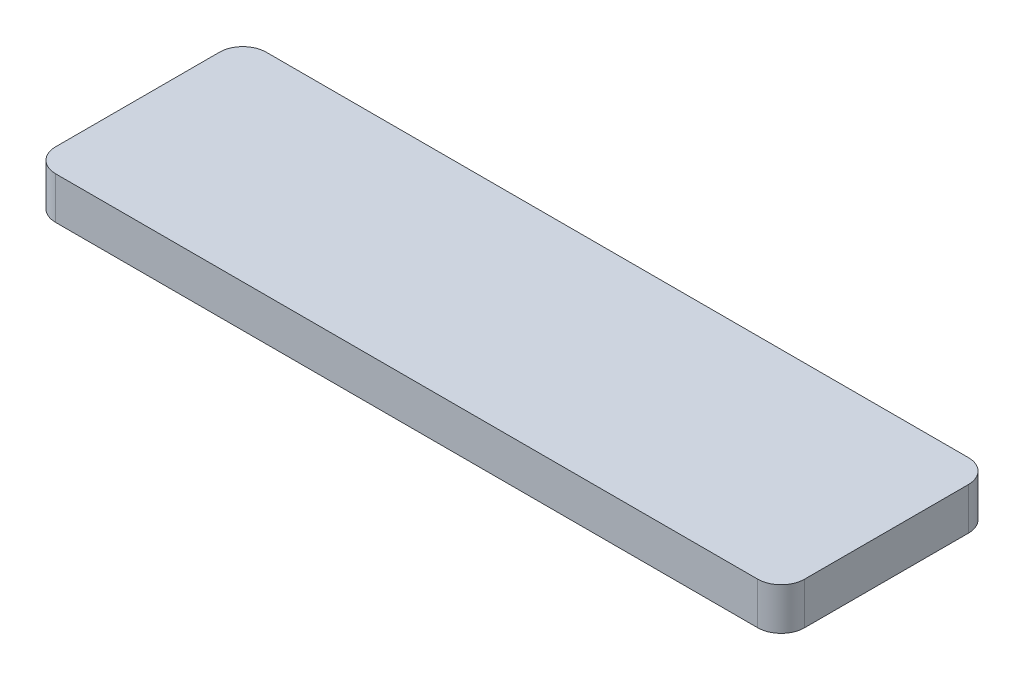
ISO-10303-21;
HEADER;
FILE_DESCRIPTION(('STEP AP214'),'2;1');
FILE_NAME('part.step','',(''),(''),'','','');
FILE_SCHEMA(('AUTOMOTIVE_DESIGN { 1 0 10303 214 1 1 1 1 }'));
ENDSEC;
DATA;
#1=APPLICATION_CONTEXT('core data for automotive mechanical design processes');
#2=APPLICATION_PROTOCOL_DEFINITION('international standard','automotive_design',2000,#1);
#3=PRODUCT_CONTEXT('',#1,'mechanical');
#4=PRODUCT('Part','Part','',(#3));
#5=PRODUCT_RELATED_PRODUCT_CATEGORY('part','',(#4));
#6=PRODUCT_DEFINITION_FORMATION('','',#4);
#7=PRODUCT_DEFINITION_CONTEXT('part definition',#1,'design');
#8=PRODUCT_DEFINITION('design','',#6,#7);
#9=PRODUCT_DEFINITION_SHAPE('','',#8);
#10=(LENGTH_UNIT() NAMED_UNIT(*) SI_UNIT(.MILLI.,.METRE.));
#11=(NAMED_UNIT(*) PLANE_ANGLE_UNIT() SI_UNIT($,.RADIAN.));
#12=(NAMED_UNIT(*) SI_UNIT($,.STERADIAN.) SOLID_ANGLE_UNIT());
#13=UNCERTAINTY_MEASURE_WITH_UNIT(LENGTH_MEASURE(1.E-05),#10,'distance_accuracy_value','');
#14=(GEOMETRIC_REPRESENTATION_CONTEXT(3) GLOBAL_UNCERTAINTY_ASSIGNED_CONTEXT((#13)) GLOBAL_UNIT_ASSIGNED_CONTEXT((#10,
#11,#12)) REPRESENTATION_CONTEXT('',''));
#15=CARTESIAN_POINT('',(0.,0.,0.));
#16=DIRECTION('',(0.,0.,1.));
#17=DIRECTION('',(1.,0.,0.));
#18=AXIS2_PLACEMENT_3D('',#15,#16,#17);
#19=CARTESIAN_POINT('',(-160.,18.,45.));
#20=DIRECTION('',(1.,0.,0.));
#21=DIRECTION('',(0.,0.,-1.));
#22=AXIS2_PLACEMENT_3D('',#19,#20,#21);
#23=PLANE('',#22);
#24=DIRECTION('',(0.,0.,1.));
#25=VECTOR('',#24,1.);
#26=CARTESIAN_POINT('',(-160.,18.,45.));
#27=LINE('',#26,#25);
#28=CARTESIAN_POINT('',(-160.,18.,-35.));
#29=VERTEX_POINT('',#28);
#30=CARTESIAN_POINT('',(-160.,18.,35.));
#31=VERTEX_POINT('',#30);
#32=EDGE_CURVE('E122',#29,#31,#27,.T.);
#33=ORIENTED_EDGE('',*,*,#32,.F.);
#34=DIRECTION('',(0.,-1.,0.));
#35=VECTOR('',#34,1.);
#36=CARTESIAN_POINT('',(-160.,18.,-35.));
#37=LINE('',#36,#35);
#38=CARTESIAN_POINT('',(-160.,0.,-35.));
#39=VERTEX_POINT('',#38);
#40=EDGE_CURVE('E107',#29,#39,#37,.T.);
#41=ORIENTED_EDGE('',*,*,#40,.T.);
#42=DIRECTION('',(0.,0.,1.));
#43=VECTOR('',#42,1.);
#44=CARTESIAN_POINT('',(-160.,0.,45.));
#45=LINE('',#44,#43);
#46=CARTESIAN_POINT('',(-160.,0.,35.));
#47=VERTEX_POINT('',#46);
#48=EDGE_CURVE('E119',#39,#47,#45,.T.);
#49=ORIENTED_EDGE('',*,*,#48,.T.);
#50=DIRECTION('',(0.,-1.,0.));
#51=VECTOR('',#50,1.);
#52=CARTESIAN_POINT('',(-160.,18.,35.));
#53=LINE('',#52,#51);
#54=EDGE_CURVE('E124',#47,#31,#53,.F.);
#55=ORIENTED_EDGE('',*,*,#54,.T.);
#56=EDGE_LOOP('',(#33,#41,#49,#55));
#57=FACE_BOUND('',#56,.T.);
#58=ADVANCED_FACE('F37',(#57),#23,.F.);
#59=CARTESIAN_POINT('',(-160.,18.,45.));
#60=DIRECTION('',(0.,0.,-1.));
#61=DIRECTION('',(-1.,0.,0.));
#62=AXIS2_PLACEMENT_3D('',#59,#60,#61);
#63=PLANE('',#62);
#64=DIRECTION('',(1.,0.,0.));
#65=VECTOR('',#64,1.);
#66=CARTESIAN_POINT('',(-160.,0.,45.));
#67=LINE('',#66,#65);
#68=CARTESIAN_POINT('',(-150.,0.,45.));
#69=VERTEX_POINT('',#68);
#70=CARTESIAN_POINT('',(150.,0.,45.));
#71=VERTEX_POINT('',#70);
#72=EDGE_CURVE('E128',#69,#71,#67,.T.);
#73=ORIENTED_EDGE('',*,*,#72,.T.);
#74=DIRECTION('',(0.,-1.,0.));
#75=VECTOR('',#74,1.);
#76=CARTESIAN_POINT('',(150.,18.,45.));
#77=LINE('',#76,#75);
#78=CARTESIAN_POINT('',(150.,18.,45.));
#79=VERTEX_POINT('',#78);
#80=EDGE_CURVE('E11',#71,#79,#77,.F.);
#81=ORIENTED_EDGE('',*,*,#80,.T.);
#82=DIRECTION('',(1.,0.,0.));
#83=VECTOR('',#82,1.);
#84=CARTESIAN_POINT('',(-160.,18.,45.));
#85=LINE('',#84,#83);
#86=CARTESIAN_POINT('',(-150.,18.,45.));
#87=VERTEX_POINT('',#86);
#88=EDGE_CURVE('E164',#87,#79,#85,.T.);
#89=ORIENTED_EDGE('',*,*,#88,.F.);
#90=DIRECTION('',(0.,-1.,0.));
#91=VECTOR('',#90,1.);
#92=CARTESIAN_POINT('',(-150.,18.,45.));
#93=LINE('',#92,#91);
#94=EDGE_CURVE('E45',#87,#69,#93,.T.);
#95=ORIENTED_EDGE('',*,*,#94,.T.);
#96=EDGE_LOOP('',(#73,#81,#89,#95));
#97=FACE_BOUND('',#96,.T.);
#98=ADVANCED_FACE('F162',(#97),#63,.F.);
#99=CARTESIAN_POINT('',(160.,18.,45.));
#100=DIRECTION('',(-1.,0.,0.));
#101=DIRECTION('',(0.,0.,1.));
#102=AXIS2_PLACEMENT_3D('',#99,#100,#101);
#103=PLANE('',#102);
#104=DIRECTION('',(0.,0.,-1.));
#105=VECTOR('',#104,1.);
#106=CARTESIAN_POINT('',(160.,0.,45.));
#107=LINE('',#106,#105);
#108=CARTESIAN_POINT('',(160.,0.,35.));
#109=VERTEX_POINT('',#108);
#110=CARTESIAN_POINT('',(160.,0.,-35.));
#111=VERTEX_POINT('',#110);
#112=EDGE_CURVE('E131',#109,#111,#107,.T.);
#113=ORIENTED_EDGE('',*,*,#112,.T.);
#114=DIRECTION('',(0.,-1.,0.));
#115=VECTOR('',#114,1.);
#116=CARTESIAN_POINT('',(160.,18.,-35.));
#117=LINE('',#116,#115);
#118=CARTESIAN_POINT('',(160.,18.,-35.));
#119=VERTEX_POINT('',#118);
#120=EDGE_CURVE('E52',#111,#119,#117,.F.);
#121=ORIENTED_EDGE('',*,*,#120,.T.);
#122=DIRECTION('',(0.,0.,-1.));
#123=VECTOR('',#122,1.);
#124=CARTESIAN_POINT('',(160.,18.,45.));
#125=LINE('',#124,#123);
#126=CARTESIAN_POINT('',(160.,18.,35.));
#127=VERTEX_POINT('',#126);
#128=EDGE_CURVE('E172',#127,#119,#125,.T.);
#129=ORIENTED_EDGE('',*,*,#128,.F.);
#130=DIRECTION('',(0.,-1.,0.));
#131=VECTOR('',#130,1.);
#132=CARTESIAN_POINT('',(160.,18.,35.));
#133=LINE('',#132,#131);
#134=EDGE_CURVE('E155',#127,#109,#133,.T.);
#135=ORIENTED_EDGE('',*,*,#134,.T.);
#136=EDGE_LOOP('',(#113,#121,#129,#135));
#137=FACE_BOUND('',#136,.T.);
#138=ADVANCED_FACE('F171',(#137),#103,.F.);
#139=CARTESIAN_POINT('',(-160.,18.,-45.));
#140=DIRECTION('',(0.,0.,1.));
#141=DIRECTION('',(1.,0.,0.));
#142=AXIS2_PLACEMENT_3D('',#139,#140,#141);
#143=PLANE('',#142);
#144=DIRECTION('',(-1.,0.,0.));
#145=VECTOR('',#144,1.);
#146=CARTESIAN_POINT('',(-160.,0.,-45.));
#147=LINE('',#146,#145);
#148=CARTESIAN_POINT('',(150.,0.,-45.));
#149=VERTEX_POINT('',#148);
#150=CARTESIAN_POINT('',(-150.,0.,-45.));
#151=VERTEX_POINT('',#150);
#152=EDGE_CURVE('E138',#149,#151,#147,.T.);
#153=ORIENTED_EDGE('',*,*,#152,.T.);
#154=DIRECTION('',(0.,-1.,0.));
#155=VECTOR('',#154,1.);
#156=CARTESIAN_POINT('',(-150.,18.,-45.));
#157=LINE('',#156,#155);
#158=CARTESIAN_POINT('',(-150.,18.,-45.));
#159=VERTEX_POINT('',#158);
#160=EDGE_CURVE('E108',#151,#159,#157,.F.);
#161=ORIENTED_EDGE('',*,*,#160,.T.);
#162=DIRECTION('',(-1.,0.,0.));
#163=VECTOR('',#162,1.);
#164=CARTESIAN_POINT('',(-160.,18.,-45.));
#165=LINE('',#164,#163);
#166=CARTESIAN_POINT('',(150.,18.,-45.));
#167=VERTEX_POINT('',#166);
#168=EDGE_CURVE('E134',#167,#159,#165,.T.);
#169=ORIENTED_EDGE('',*,*,#168,.F.);
#170=DIRECTION('',(0.,-1.,0.));
#171=VECTOR('',#170,1.);
#172=CARTESIAN_POINT('',(150.,18.,-45.));
#173=LINE('',#172,#171);
#174=EDGE_CURVE('E113',#167,#149,#173,.T.);
#175=ORIENTED_EDGE('',*,*,#174,.T.);
#176=EDGE_LOOP('',(#153,#161,#169,#175));
#177=FACE_BOUND('',#176,.T.);
#178=ADVANCED_FACE('F200',(#177),#143,.F.);
#179=CARTESIAN_POINT('',(0.,18.,0.));
#180=DIRECTION('',(0.,-1.,0.));
#181=DIRECTION('',(0.,0.,-1.));
#182=AXIS2_PLACEMENT_3D('',#179,#180,#181);
#183=PLANE('',#182);
#184=ORIENTED_EDGE('',*,*,#168,.T.);
#185=CARTESIAN_POINT('',(-150.,18.,-35.));
#186=DIRECTION('',(0.,-1.,0.));
#187=DIRECTION('',(0.,0.,-1.));
#188=AXIS2_PLACEMENT_3D('',#185,#186,#187);
#189=CIRCLE('',#188,10.);
#190=EDGE_CURVE('E153',#159,#29,#189,.F.);
#191=ORIENTED_EDGE('',*,*,#190,.T.);
#192=ORIENTED_EDGE('',*,*,#32,.T.);
#193=CARTESIAN_POINT('',(-150.,18.,35.));
#194=DIRECTION('',(0.,-1.,0.));
#195=DIRECTION('',(0.,0.,-1.));
#196=AXIS2_PLACEMENT_3D('',#193,#194,#195);
#197=CIRCLE('',#196,10.);
#198=EDGE_CURVE('E148',#31,#87,#197,.F.);
#199=ORIENTED_EDGE('',*,*,#198,.T.);
#200=ORIENTED_EDGE('',*,*,#88,.T.);
#201=CARTESIAN_POINT('',(150.,18.,35.));
#202=DIRECTION('',(0.,-1.,0.));
#203=DIRECTION('',(0.,0.,-1.));
#204=AXIS2_PLACEMENT_3D('',#201,#202,#203);
#205=CIRCLE('',#204,10.);
#206=EDGE_CURVE('E59',#79,#127,#205,.F.);
#207=ORIENTED_EDGE('',*,*,#206,.T.);
#208=ORIENTED_EDGE('',*,*,#128,.T.);
#209=CARTESIAN_POINT('',(150.,18.,-35.));
#210=DIRECTION('',(0.,-1.,0.));
#211=DIRECTION('',(0.,0.,-1.));
#212=AXIS2_PLACEMENT_3D('',#209,#210,#211);
#213=CIRCLE('',#212,10.);
#214=EDGE_CURVE('E151',#119,#167,#213,.F.);
#215=ORIENTED_EDGE('',*,*,#214,.T.);
#216=EDGE_LOOP('',(#184,#191,#192,#199,#200,#207,#208,#215));
#217=FACE_BOUND('',#216,.T.);
#218=ADVANCED_FACE('F177',(#217),#183,.F.);
#219=CARTESIAN_POINT('',(0.,0.,0.));
#220=DIRECTION('',(0.,-1.,0.));
#221=DIRECTION('',(0.,0.,-1.));
#222=AXIS2_PLACEMENT_3D('',#219,#220,#221);
#223=PLANE('',#222);
#224=ORIENTED_EDGE('',*,*,#48,.F.);
#225=CARTESIAN_POINT('',(-150.,0.,-35.));
#226=DIRECTION('',(0.,-1.,0.));
#227=DIRECTION('',(0.,0.,-1.));
#228=AXIS2_PLACEMENT_3D('',#225,#226,#227);
#229=CIRCLE('',#228,10.);
#230=EDGE_CURVE('E103',#39,#151,#229,.T.);
#231=ORIENTED_EDGE('',*,*,#230,.T.);
#232=ORIENTED_EDGE('',*,*,#152,.F.);
#233=CARTESIAN_POINT('',(150.,0.,-35.));
#234=DIRECTION('',(0.,-1.,0.));
#235=DIRECTION('',(0.,0.,-1.));
#236=AXIS2_PLACEMENT_3D('',#233,#234,#235);
#237=CIRCLE('',#236,10.);
#238=EDGE_CURVE('E114',#149,#111,#237,.T.);
#239=ORIENTED_EDGE('',*,*,#238,.T.);
#240=ORIENTED_EDGE('',*,*,#112,.F.);
#241=CARTESIAN_POINT('',(150.,0.,35.));
#242=DIRECTION('',(0.,-1.,0.));
#243=DIRECTION('',(0.,0.,-1.));
#244=AXIS2_PLACEMENT_3D('',#241,#242,#243);
#245=CIRCLE('',#244,10.);
#246=EDGE_CURVE('E142',#109,#71,#245,.T.);
#247=ORIENTED_EDGE('',*,*,#246,.T.);
#248=ORIENTED_EDGE('',*,*,#72,.F.);
#249=CARTESIAN_POINT('',(-150.,0.,35.));
#250=DIRECTION('',(0.,-1.,0.));
#251=DIRECTION('',(0.,0.,-1.));
#252=AXIS2_PLACEMENT_3D('',#249,#250,#251);
#253=CIRCLE('',#252,10.);
#254=EDGE_CURVE('E123',#69,#47,#253,.T.);
#255=ORIENTED_EDGE('',*,*,#254,.T.);
#256=EDGE_LOOP('',(#224,#231,#232,#239,#240,#247,#248,#255));
#257=FACE_BOUND('',#256,.T.);
#258=ADVANCED_FACE('F126',(#257),#223,.T.);
#259=CARTESIAN_POINT('',(-150.,18.,-35.));
#260=DIRECTION('',(0.,-1.,0.));
#261=DIRECTION('',(0.,0.,-1.));
#262=AXIS2_PLACEMENT_3D('',#259,#260,#261);
#263=CYLINDRICAL_SURFACE('',#262,10.);
#264=ORIENTED_EDGE('',*,*,#190,.F.);
#265=ORIENTED_EDGE('',*,*,#160,.F.);
#266=ORIENTED_EDGE('',*,*,#230,.F.);
#267=ORIENTED_EDGE('',*,*,#40,.F.);
#268=EDGE_LOOP('',(#264,#265,#266,#267));
#269=FACE_BOUND('',#268,.T.);
#270=ADVANCED_FACE('F106',(#269),#263,.T.);
#271=CARTESIAN_POINT('',(150.,18.,-35.));
#272=DIRECTION('',(0.,-1.,0.));
#273=DIRECTION('',(0.,0.,-1.));
#274=AXIS2_PLACEMENT_3D('',#271,#272,#273);
#275=CYLINDRICAL_SURFACE('',#274,10.);
#276=ORIENTED_EDGE('',*,*,#214,.F.);
#277=ORIENTED_EDGE('',*,*,#120,.F.);
#278=ORIENTED_EDGE('',*,*,#238,.F.);
#279=ORIENTED_EDGE('',*,*,#174,.F.);
#280=EDGE_LOOP('',(#276,#277,#278,#279));
#281=FACE_BOUND('',#280,.T.);
#282=ADVANCED_FACE('F182',(#281),#275,.T.);
#283=CARTESIAN_POINT('',(150.,18.,35.));
#284=DIRECTION('',(0.,-1.,0.));
#285=DIRECTION('',(0.,0.,-1.));
#286=AXIS2_PLACEMENT_3D('',#283,#284,#285);
#287=CYLINDRICAL_SURFACE('',#286,10.);
#288=ORIENTED_EDGE('',*,*,#206,.F.);
#289=ORIENTED_EDGE('',*,*,#80,.F.);
#290=ORIENTED_EDGE('',*,*,#246,.F.);
#291=ORIENTED_EDGE('',*,*,#134,.F.);
#292=EDGE_LOOP('',(#288,#289,#290,#291));
#293=FACE_BOUND('',#292,.T.);
#294=ADVANCED_FACE('F170',(#293),#287,.T.);
#295=CARTESIAN_POINT('',(-150.,18.,35.));
#296=DIRECTION('',(0.,-1.,0.));
#297=DIRECTION('',(0.,0.,-1.));
#298=AXIS2_PLACEMENT_3D('',#295,#296,#297);
#299=CYLINDRICAL_SURFACE('',#298,10.);
#300=ORIENTED_EDGE('',*,*,#198,.F.);
#301=ORIENTED_EDGE('',*,*,#54,.F.);
#302=ORIENTED_EDGE('',*,*,#254,.F.);
#303=ORIENTED_EDGE('',*,*,#94,.F.);
#304=EDGE_LOOP('',(#300,#301,#302,#303));
#305=FACE_BOUND('',#304,.T.);
#306=ADVANCED_FACE('F39',(#305),#299,.T.);
#307=CLOSED_SHELL('',(#58,#98,#138,#178,#218,#258,#270,#282,#294,#306));
#308=MANIFOLD_SOLID_BREP('B2',#307);
#309=ADVANCED_BREP_SHAPE_REPRESENTATION('',(#18,#308),#14);
#310=SHAPE_DEFINITION_REPRESENTATION(#9,#309);
ENDSEC;
END-ISO-10303-21;
